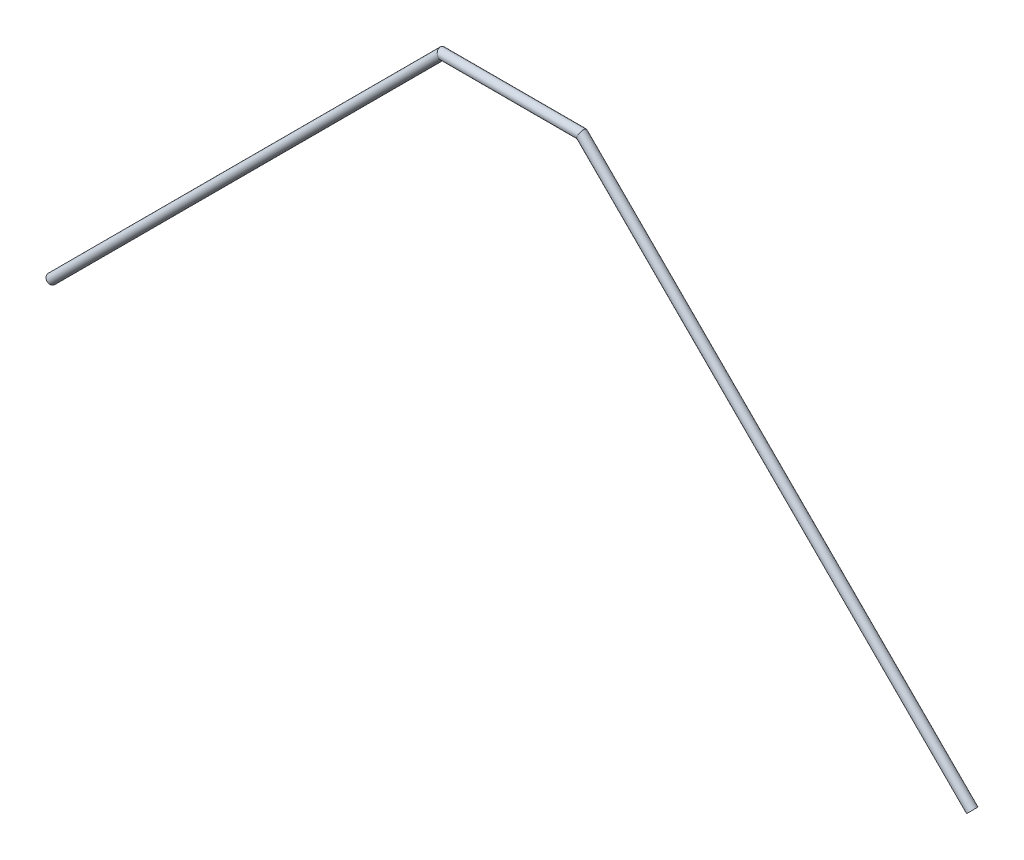
ISO-10303-21;
HEADER;
FILE_DESCRIPTION(('STEP AP214'),'2;1');
FILE_NAME('part.step','',(''),(''),'','','');
FILE_SCHEMA(('AUTOMOTIVE_DESIGN { 1 0 10303 214 1 1 1 1 }'));
ENDSEC;
DATA;
#1=APPLICATION_CONTEXT('core data for automotive mechanical design processes');
#2=APPLICATION_PROTOCOL_DEFINITION('international standard','automotive_design',2000,#1);
#3=PRODUCT_CONTEXT('',#1,'mechanical');
#4=PRODUCT('Part','Part','',(#3));
#5=PRODUCT_RELATED_PRODUCT_CATEGORY('part','',(#4));
#6=PRODUCT_DEFINITION_FORMATION('','',#4);
#7=PRODUCT_DEFINITION_CONTEXT('part definition',#1,'design');
#8=PRODUCT_DEFINITION('design','',#6,#7);
#9=PRODUCT_DEFINITION_SHAPE('','',#8);
#10=(LENGTH_UNIT() NAMED_UNIT(*) SI_UNIT(.MILLI.,.METRE.));
#11=(NAMED_UNIT(*) PLANE_ANGLE_UNIT() SI_UNIT($,.RADIAN.));
#12=(NAMED_UNIT(*) SI_UNIT($,.STERADIAN.) SOLID_ANGLE_UNIT());
#13=UNCERTAINTY_MEASURE_WITH_UNIT(LENGTH_MEASURE(1.E-05),#10,'distance_accuracy_value','');
#14=(GEOMETRIC_REPRESENTATION_CONTEXT(3) GLOBAL_UNCERTAINTY_ASSIGNED_CONTEXT((#13)) GLOBAL_UNIT_ASSIGNED_CONTEXT((#10,
#11,#12)) REPRESENTATION_CONTEXT('',''));
#15=CARTESIAN_POINT('',(0.,0.,0.));
#16=DIRECTION('',(0.,0.,1.));
#17=DIRECTION('',(1.,0.,0.));
#18=AXIS2_PLACEMENT_3D('',#15,#16,#17);
#19=CARTESIAN_POINT('',(-2514.60000000002,-2133.6,0.));
#20=DIRECTION('',(0.707106781186551,0.707106781186544,0.));
#21=DIRECTION('',(0.,0.,-1.));
#22=AXIS2_PLACEMENT_3D('',#19,#20,#21);
#23=PLANE('',#22);
#24=CARTESIAN_POINT('',(-2514.60000000002,-2133.6,0.));
#25=DIRECTION('',(0.707106781186551,0.707106781186544,0.));
#26=DIRECTION('',(0.,0.,-1.));
#27=AXIS2_PLACEMENT_3D('',#24,#25,#26);
#28=CIRCLE('',#27,25.4);
#29=CARTESIAN_POINT('',(-2514.60000000002,-2133.6,-25.4));
#30=VERTEX_POINT('',#29);
#31=EDGE_CURVE('E35',#30,#30,#28,.T.);
#32=ORIENTED_EDGE('',*,*,#31,.F.);
#33=EDGE_LOOP('',(#32));
#34=FACE_BOUND('',#33,.T.);
#35=ADVANCED_FACE('F32',(#34),#23,.F.);
#36=CARTESIAN_POINT('',(2514.60000000002,-2133.6,0.));
#37=DIRECTION('',(0.707106781186552,-0.707106781186543,0.));
#38=DIRECTION('',(0.,0.,-1.));
#39=AXIS2_PLACEMENT_3D('',#36,#37,#38);
#40=PLANE('',#39);
#41=CARTESIAN_POINT('',(2514.60000000002,-2133.6,0.));
#42=DIRECTION('',(0.707106781186552,-0.707106781186543,0.));
#43=DIRECTION('',(0.,0.,-1.));
#44=AXIS2_PLACEMENT_3D('',#41,#42,#43);
#45=CIRCLE('',#44,25.4);
#46=CARTESIAN_POINT('',(2514.60000000002,-2133.6,-25.4));
#47=VERTEX_POINT('',#46);
#48=EDGE_CURVE('E39',#47,#47,#45,.T.);
#49=ORIENTED_EDGE('',*,*,#48,.T.);
#50=EDGE_LOOP('',(#49));
#51=FACE_BOUND('',#50,.T.);
#52=ADVANCED_FACE('F55',(#51),#40,.T.);
#53=CARTESIAN_POINT('',(-364.562416254586,16.4375837454142,0.));
#54=DIRECTION('',(-0.707106781186551,-0.707106781186544,0.));
#55=DIRECTION('',(0.707106781186544,-0.707106781186551,0.));
#56=AXIS2_PLACEMENT_3D('',#53,#54,#55);
#57=CYLINDRICAL_SURFACE('',#56,25.4);
#58=CARTESIAN_POINT('',(-381.,0.,0.));
#59=DIRECTION('',(-0.923879532511288,-0.382683432365087,0.));
#60=DIRECTION('',(-0.382683432365088,0.923879532511288,0.));
#61=AXIS2_PLACEMENT_3D('',#58,#59,#60);
#62=ELLIPSE('',#61,27.4927618874268,25.4);
#63=CARTESIAN_POINT('',(-391.521024484277,25.4,0.));
#64=VERTEX_POINT('',#63);
#65=EDGE_CURVE('E44',#64,#64,#62,.T.);
#66=ORIENTED_EDGE('',*,*,#65,.T.);
#67=EDGE_LOOP('',(#66));
#68=FACE_BOUND('',#67,.T.);
#69=ORIENTED_EDGE('',*,*,#31,.T.);
#70=EDGE_LOOP('',(#69));
#71=FACE_BOUND('',#70,.T.);
#72=ADVANCED_FACE('F52',(#68,#71),#57,.T.);
#73=CARTESIAN_POINT('',(404.246253865408,0.,0.));
#74=DIRECTION('',(-1.,0.,0.));
#75=DIRECTION('',(0.,0.,1.));
#76=AXIS2_PLACEMENT_3D('',#73,#74,#75);
#77=CYLINDRICAL_SURFACE('',#76,25.4);
#78=CARTESIAN_POINT('',(381.,4.44089209850063E-13,0.));
#79=DIRECTION('',(-0.923879532511288,0.382683432365087,0.));
#80=DIRECTION('',(0.382683432365087,0.923879532511288,0.));
#81=AXIS2_PLACEMENT_3D('',#78,#79,#80);
#82=ELLIPSE('',#81,27.4927618874268,25.4);
#83=CARTESIAN_POINT('',(391.521024484276,25.4000000000004,0.));
#84=VERTEX_POINT('',#83);
#85=EDGE_CURVE('E10',#84,#84,#82,.T.);
#86=ORIENTED_EDGE('',*,*,#85,.T.);
#87=EDGE_LOOP('',(#86));
#88=FACE_BOUND('',#87,.T.);
#89=ORIENTED_EDGE('',*,*,#65,.F.);
#90=EDGE_LOOP('',(#89));
#91=FACE_BOUND('',#90,.T.);
#92=ADVANCED_FACE('F62',(#88,#91),#77,.T.);
#93=CARTESIAN_POINT('',(2514.60000000002,-2133.6,0.));
#94=DIRECTION('',(-0.707106781186552,0.707106781186543,0.));
#95=DIRECTION('',(-0.707106781186543,-0.707106781186552,0.));
#96=AXIS2_PLACEMENT_3D('',#93,#94,#95);
#97=CYLINDRICAL_SURFACE('',#96,25.4);
#98=ORIENTED_EDGE('',*,*,#48,.F.);
#99=EDGE_LOOP('',(#98));
#100=FACE_BOUND('',#99,.T.);
#101=ORIENTED_EDGE('',*,*,#85,.F.);
#102=EDGE_LOOP('',(#101));
#103=FACE_BOUND('',#102,.T.);
#104=ADVANCED_FACE('F60',(#100,#103),#97,.T.);
#105=CLOSED_SHELL('',(#35,#52,#72,#92,#104));
#106=MANIFOLD_SOLID_BREP('B2',#105);
#107=ADVANCED_BREP_SHAPE_REPRESENTATION('',(#18,#106),#14);
#108=SHAPE_DEFINITION_REPRESENTATION(#9,#107);
ENDSEC;
END-ISO-10303-21;
